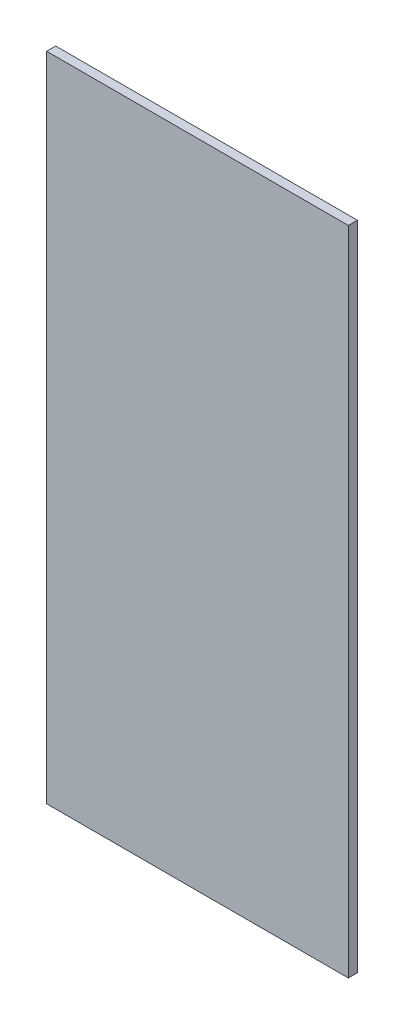
ISO-10303-21;
HEADER;
FILE_DESCRIPTION(('STEP AP214'),'2;1');
FILE_NAME('part.step','',(''),(''),'','','');
FILE_SCHEMA(('AUTOMOTIVE_DESIGN { 1 0 10303 214 1 1 1 1 }'));
ENDSEC;
DATA;
#1=APPLICATION_CONTEXT('core data for automotive mechanical design processes');
#2=APPLICATION_PROTOCOL_DEFINITION('international standard','automotive_design',2000,#1);
#3=PRODUCT_CONTEXT('',#1,'mechanical');
#4=PRODUCT('Part','Part','',(#3));
#5=PRODUCT_RELATED_PRODUCT_CATEGORY('part','',(#4));
#6=PRODUCT_DEFINITION_FORMATION('','',#4);
#7=PRODUCT_DEFINITION_CONTEXT('part definition',#1,'design');
#8=PRODUCT_DEFINITION('design','',#6,#7);
#9=PRODUCT_DEFINITION_SHAPE('','',#8);
#10=(LENGTH_UNIT() NAMED_UNIT(*) SI_UNIT(.MILLI.,.METRE.));
#11=(NAMED_UNIT(*) PLANE_ANGLE_UNIT() SI_UNIT($,.RADIAN.));
#12=(NAMED_UNIT(*) SI_UNIT($,.STERADIAN.) SOLID_ANGLE_UNIT());
#13=UNCERTAINTY_MEASURE_WITH_UNIT(LENGTH_MEASURE(1.E-05),#10,'distance_accuracy_value','');
#14=(GEOMETRIC_REPRESENTATION_CONTEXT(3) GLOBAL_UNCERTAINTY_ASSIGNED_CONTEXT((#13)) GLOBAL_UNIT_ASSIGNED_CONTEXT((#10,
#11,#12)) REPRESENTATION_CONTEXT('',''));
#15=CARTESIAN_POINT('',(0.,0.,0.));
#16=DIRECTION('',(0.,0.,1.));
#17=DIRECTION('',(1.,0.,0.));
#18=AXIS2_PLACEMENT_3D('',#15,#16,#17);
#19=CARTESIAN_POINT('',(0.,0.,19.05));
#20=DIRECTION('',(1.,0.,0.));
#21=DIRECTION('',(0.,1.,0.));
#22=AXIS2_PLACEMENT_3D('',#19,#20,#21);
#23=PLANE('',#22);
#24=DIRECTION('',(0.,-1.,0.));
#25=VECTOR('',#24,1.);
#26=CARTESIAN_POINT('',(0.,0.,0.));
#27=LINE('',#26,#25);
#28=CARTESIAN_POINT('',(0.,0.,0.));
#29=VERTEX_POINT('',#28);
#30=CARTESIAN_POINT('',(1.67972554971051E-13,-1371.6,0.));
#31=VERTEX_POINT('',#30);
#32=EDGE_CURVE('E96',#29,#31,#27,.T.);
#33=ORIENTED_EDGE('',*,*,#32,.T.);
#34=DIRECTION('',(0.,0.,-1.));
#35=VECTOR('',#34,1.);
#36=CARTESIAN_POINT('',(1.67972554971051E-13,-1371.6,19.05));
#37=LINE('',#36,#35);
#38=CARTESIAN_POINT('',(1.67972554971051E-13,-1371.6,19.05));
#39=VERTEX_POINT('',#38);
#40=EDGE_CURVE('E11',#39,#31,#37,.T.);
#41=ORIENTED_EDGE('',*,*,#40,.F.);
#42=DIRECTION('',(0.,-1.,0.));
#43=VECTOR('',#42,1.);
#44=CARTESIAN_POINT('',(0.,0.,19.05));
#45=LINE('',#44,#43);
#46=CARTESIAN_POINT('',(0.,0.,19.05));
#47=VERTEX_POINT('',#46);
#48=EDGE_CURVE('E84',#47,#39,#45,.T.);
#49=ORIENTED_EDGE('',*,*,#48,.F.);
#50=DIRECTION('',(0.,0.,-1.));
#51=VECTOR('',#50,1.);
#52=CARTESIAN_POINT('',(0.,0.,19.05));
#53=LINE('',#52,#51);
#54=EDGE_CURVE('E92',#47,#29,#53,.T.);
#55=ORIENTED_EDGE('',*,*,#54,.T.);
#56=EDGE_LOOP('',(#33,#41,#49,#55));
#57=FACE_BOUND('',#56,.T.);
#58=ADVANCED_FACE('F33',(#57),#23,.F.);
#59=CARTESIAN_POINT('',(1.67972554971051E-13,-1371.6,19.05));
#60=DIRECTION('',(0.,1.,0.));
#61=DIRECTION('',(0.,0.,1.));
#62=AXIS2_PLACEMENT_3D('',#59,#60,#61);
#63=PLANE('',#62);
#64=DIRECTION('',(1.,0.,0.));
#65=VECTOR('',#64,1.);
#66=CARTESIAN_POINT('',(1.67972554971051E-13,-1371.6,0.));
#67=LINE('',#66,#65);
#68=CARTESIAN_POINT('',(635.,-1371.6,0.));
#69=VERTEX_POINT('',#68);
#70=EDGE_CURVE('E88',#31,#69,#67,.T.);
#71=ORIENTED_EDGE('',*,*,#70,.T.);
#72=DIRECTION('',(0.,0.,-1.));
#73=VECTOR('',#72,1.);
#74=CARTESIAN_POINT('',(635.,-1371.6,19.05));
#75=LINE('',#74,#73);
#76=CARTESIAN_POINT('',(635.,-1371.6,19.05));
#77=VERTEX_POINT('',#76);
#78=EDGE_CURVE('E41',#77,#69,#75,.T.);
#79=ORIENTED_EDGE('',*,*,#78,.F.);
#80=DIRECTION('',(1.,0.,0.));
#81=VECTOR('',#80,1.);
#82=CARTESIAN_POINT('',(1.67972554971051E-13,-1371.6,19.05));
#83=LINE('',#82,#81);
#84=EDGE_CURVE('E79',#39,#77,#83,.T.);
#85=ORIENTED_EDGE('',*,*,#84,.F.);
#86=ORIENTED_EDGE('',*,*,#40,.T.);
#87=EDGE_LOOP('',(#71,#79,#85,#86));
#88=FACE_BOUND('',#87,.T.);
#89=ADVANCED_FACE('F87',(#88),#63,.F.);
#90=CARTESIAN_POINT('',(635.,0.,19.05));
#91=DIRECTION('',(-1.,0.,0.));
#92=DIRECTION('',(0.,-1.,0.));
#93=AXIS2_PLACEMENT_3D('',#90,#91,#92);
#94=PLANE('',#93);
#95=DIRECTION('',(0.,1.,0.));
#96=VECTOR('',#95,1.);
#97=CARTESIAN_POINT('',(635.,0.,0.));
#98=LINE('',#97,#96);
#99=CARTESIAN_POINT('',(635.,0.,0.));
#100=VERTEX_POINT('',#99);
#101=EDGE_CURVE('E66',#69,#100,#98,.T.);
#102=ORIENTED_EDGE('',*,*,#101,.T.);
#103=DIRECTION('',(0.,0.,-1.));
#104=VECTOR('',#103,1.);
#105=CARTESIAN_POINT('',(635.,0.,19.05));
#106=LINE('',#105,#104);
#107=CARTESIAN_POINT('',(635.,0.,19.05));
#108=VERTEX_POINT('',#107);
#109=EDGE_CURVE('E89',#108,#100,#106,.T.);
#110=ORIENTED_EDGE('',*,*,#109,.F.);
#111=DIRECTION('',(0.,1.,0.));
#112=VECTOR('',#111,1.);
#113=CARTESIAN_POINT('',(635.,0.,19.05));
#114=LINE('',#113,#112);
#115=EDGE_CURVE('E82',#77,#108,#114,.T.);
#116=ORIENTED_EDGE('',*,*,#115,.F.);
#117=ORIENTED_EDGE('',*,*,#78,.T.);
#118=EDGE_LOOP('',(#102,#110,#116,#117));
#119=FACE_BOUND('',#118,.T.);
#120=ADVANCED_FACE('F90',(#119),#94,.F.);
#121=CARTESIAN_POINT('',(0.,0.,19.05));
#122=DIRECTION('',(0.,-1.,0.));
#123=DIRECTION('',(0.,0.,-1.));
#124=AXIS2_PLACEMENT_3D('',#121,#122,#123);
#125=PLANE('',#124);
#126=DIRECTION('',(-1.,0.,0.));
#127=VECTOR('',#126,1.);
#128=CARTESIAN_POINT('',(0.,0.,0.));
#129=LINE('',#128,#127);
#130=EDGE_CURVE('E72',#100,#29,#129,.T.);
#131=ORIENTED_EDGE('',*,*,#130,.T.);
#132=ORIENTED_EDGE('',*,*,#54,.F.);
#133=DIRECTION('',(-1.,0.,0.));
#134=VECTOR('',#133,1.);
#135=CARTESIAN_POINT('',(0.,0.,19.05));
#136=LINE('',#135,#134);
#137=EDGE_CURVE('E49',#108,#47,#136,.T.);
#138=ORIENTED_EDGE('',*,*,#137,.F.);
#139=ORIENTED_EDGE('',*,*,#109,.T.);
#140=EDGE_LOOP('',(#131,#132,#138,#139));
#141=FACE_BOUND('',#140,.T.);
#142=ADVANCED_FACE('F103',(#141),#125,.F.);
#143=CARTESIAN_POINT('',(0.,0.,19.05));
#144=DIRECTION('',(0.,0.,1.));
#145=DIRECTION('',(1.,0.,0.));
#146=AXIS2_PLACEMENT_3D('',#143,#144,#145);
#147=PLANE('',#146);
#148=ORIENTED_EDGE('',*,*,#48,.T.);
#149=ORIENTED_EDGE('',*,*,#84,.T.);
#150=ORIENTED_EDGE('',*,*,#115,.T.);
#151=ORIENTED_EDGE('',*,*,#137,.T.);
#152=EDGE_LOOP('',(#148,#149,#150,#151));
#153=FACE_BOUND('',#152,.T.);
#154=ADVANCED_FACE('F80',(#153),#147,.T.);
#155=CARTESIAN_POINT('',(0.,0.,0.));
#156=DIRECTION('',(0.,0.,1.));
#157=DIRECTION('',(1.,0.,0.));
#158=AXIS2_PLACEMENT_3D('',#155,#156,#157);
#159=PLANE('',#158);
#160=ORIENTED_EDGE('',*,*,#32,.F.);
#161=ORIENTED_EDGE('',*,*,#130,.F.);
#162=ORIENTED_EDGE('',*,*,#101,.F.);
#163=ORIENTED_EDGE('',*,*,#70,.F.);
#164=EDGE_LOOP('',(#160,#161,#162,#163));
#165=FACE_BOUND('',#164,.T.);
#166=ADVANCED_FACE('F106',(#165),#159,.F.);
#167=CLOSED_SHELL('',(#58,#89,#120,#142,#154,#166));
#168=MANIFOLD_SOLID_BREP('B2',#167);
#169=ADVANCED_BREP_SHAPE_REPRESENTATION('',(#18,#168),#14);
#170=SHAPE_DEFINITION_REPRESENTATION(#9,#169);
ENDSEC;
END-ISO-10303-21;
